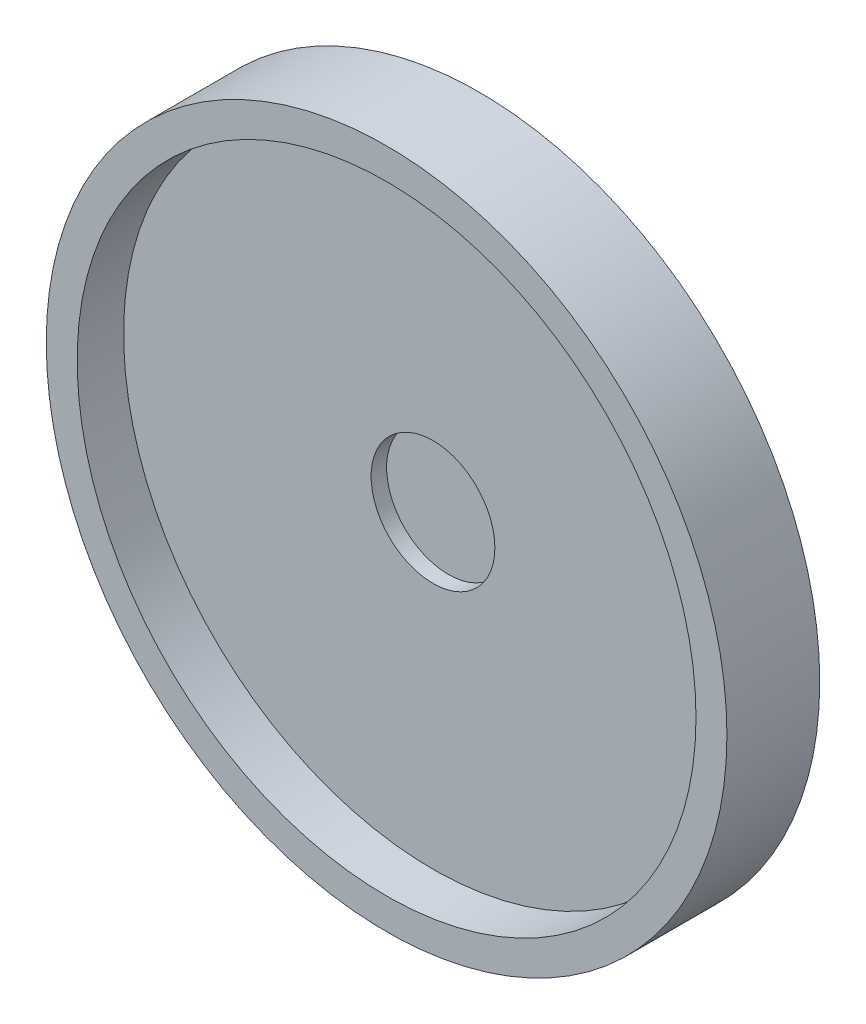
ISO-10303-21;
HEADER;
FILE_DESCRIPTION(('STEP AP214'),'2;1');
FILE_NAME('part.step','',(''),(''),'','','');
FILE_SCHEMA(('AUTOMOTIVE_DESIGN { 1 0 10303 214 1 1 1 1 }'));
ENDSEC;
DATA;
#1=APPLICATION_CONTEXT('core data for automotive mechanical design processes');
#2=APPLICATION_PROTOCOL_DEFINITION('international standard','automotive_design',2000,#1);
#3=PRODUCT_CONTEXT('',#1,'mechanical');
#4=PRODUCT('Part','Part','',(#3));
#5=PRODUCT_RELATED_PRODUCT_CATEGORY('part','',(#4));
#6=PRODUCT_DEFINITION_FORMATION('','',#4);
#7=PRODUCT_DEFINITION_CONTEXT('part definition',#1,'design');
#8=PRODUCT_DEFINITION('design','',#6,#7);
#9=PRODUCT_DEFINITION_SHAPE('','',#8);
#10=(LENGTH_UNIT() NAMED_UNIT(*) SI_UNIT(.MILLI.,.METRE.));
#11=(NAMED_UNIT(*) PLANE_ANGLE_UNIT() SI_UNIT($,.RADIAN.));
#12=(NAMED_UNIT(*) SI_UNIT($,.STERADIAN.) SOLID_ANGLE_UNIT());
#13=UNCERTAINTY_MEASURE_WITH_UNIT(LENGTH_MEASURE(1.E-05),#10,'distance_accuracy_value','');
#14=(GEOMETRIC_REPRESENTATION_CONTEXT(3) GLOBAL_UNCERTAINTY_ASSIGNED_CONTEXT((#13)) GLOBAL_UNIT_ASSIGNED_CONTEXT((#10,
#11,#12)) REPRESENTATION_CONTEXT('',''));
#15=CARTESIAN_POINT('',(0.,0.,0.));
#16=DIRECTION('',(0.,0.,1.));
#17=DIRECTION('',(1.,0.,0.));
#18=AXIS2_PLACEMENT_3D('',#15,#16,#17);
#19=CARTESIAN_POINT('',(0.,0.,3.));
#20=DIRECTION('',(0.,0.,-1.));
#21=DIRECTION('',(-1.,0.,0.));
#22=AXIS2_PLACEMENT_3D('',#19,#20,#21);
#23=CYLINDRICAL_SURFACE('',#22,4.);
#24=CARTESIAN_POINT('',(0.,0.,2.));
#25=DIRECTION('',(0.,0.,1.));
#26=DIRECTION('',(1.,0.,0.));
#27=AXIS2_PLACEMENT_3D('',#24,#25,#26);
#28=CIRCLE('',#27,4.);
#29=CARTESIAN_POINT('',(4.,0.,2.));
#30=VERTEX_POINT('',#29);
#31=EDGE_CURVE('E10',#30,#30,#28,.T.);
#32=ORIENTED_EDGE('',*,*,#31,.F.);
#33=EDGE_LOOP('',(#32));
#34=FACE_BOUND('',#33,.T.);
#35=CARTESIAN_POINT('',(0.,0.,3.));
#36=DIRECTION('',(0.,0.,1.));
#37=DIRECTION('',(1.,0.,0.));
#38=AXIS2_PLACEMENT_3D('',#35,#36,#37);
#39=CIRCLE('',#38,4.);
#40=CARTESIAN_POINT('',(4.,0.,3.));
#41=VERTEX_POINT('',#40);
#42=EDGE_CURVE('E42',#41,#41,#39,.T.);
#43=ORIENTED_EDGE('',*,*,#42,.T.);
#44=EDGE_LOOP('',(#43));
#45=FACE_BOUND('',#44,.T.);
#46=ADVANCED_FACE('F36',(#34,#45),#23,.F.);
#47=CARTESIAN_POINT('',(0.,0.,3.));
#48=DIRECTION('',(0.,0.,1.));
#49=DIRECTION('',(1.,0.,0.));
#50=AXIS2_PLACEMENT_3D('',#47,#48,#49);
#51=PLANE('',#50);
#52=ORIENTED_EDGE('',*,*,#42,.F.);
#53=EDGE_LOOP('',(#52));
#54=FACE_BOUND('',#53,.T.);
#55=CARTESIAN_POINT('',(0.,0.,3.));
#56=DIRECTION('',(0.,0.,1.));
#57=DIRECTION('',(1.,0.,0.));
#58=AXIS2_PLACEMENT_3D('',#55,#56,#57);
#59=CIRCLE('',#58,20.);
#60=CARTESIAN_POINT('',(20.,0.,3.));
#61=VERTEX_POINT('',#60);
#62=EDGE_CURVE('E46',#61,#61,#59,.F.);
#63=ORIENTED_EDGE('',*,*,#62,.F.);
#64=EDGE_LOOP('',(#63));
#65=FACE_BOUND('',#64,.T.);
#66=ADVANCED_FACE('F79',(#54,#65),#51,.T.);
#67=CARTESIAN_POINT('',(0.,0.,0.));
#68=DIRECTION('',(0.,0.,1.));
#69=DIRECTION('',(1.,0.,0.));
#70=AXIS2_PLACEMENT_3D('',#67,#68,#69);
#71=PLANE('',#70);
#72=CARTESIAN_POINT('',(0.,0.,0.));
#73=DIRECTION('',(0.,0.,1.));
#74=DIRECTION('',(1.,0.,0.));
#75=AXIS2_PLACEMENT_3D('',#72,#73,#74);
#76=CIRCLE('',#75,22.);
#77=CARTESIAN_POINT('',(22.,0.,0.));
#78=VERTEX_POINT('',#77);
#79=EDGE_CURVE('E53',#78,#78,#76,.T.);
#80=ORIENTED_EDGE('',*,*,#79,.F.);
#81=EDGE_LOOP('',(#80));
#82=FACE_BOUND('',#81,.T.);
#83=ADVANCED_FACE('F77',(#82),#71,.F.);
#84=CARTESIAN_POINT('',(0.,0.,6.));
#85=DIRECTION('',(0.,0.,-1.));
#86=DIRECTION('',(-1.,0.,0.));
#87=AXIS2_PLACEMENT_3D('',#84,#85,#86);
#88=CYLINDRICAL_SURFACE('',#87,20.);
#89=ORIENTED_EDGE('',*,*,#62,.T.);
#90=EDGE_LOOP('',(#89));
#91=FACE_BOUND('',#90,.T.);
#92=CARTESIAN_POINT('',(0.,0.,6.));
#93=DIRECTION('',(0.,0.,1.));
#94=DIRECTION('',(1.,0.,0.));
#95=AXIS2_PLACEMENT_3D('',#92,#93,#94);
#96=CIRCLE('',#95,20.);
#97=CARTESIAN_POINT('',(20.,0.,6.));
#98=VERTEX_POINT('',#97);
#99=EDGE_CURVE('E56',#98,#98,#96,.T.);
#100=ORIENTED_EDGE('',*,*,#99,.T.);
#101=EDGE_LOOP('',(#100));
#102=FACE_BOUND('',#101,.T.);
#103=ADVANCED_FACE('F62',(#91,#102),#88,.F.);
#104=CARTESIAN_POINT('',(0.,0.,6.));
#105=DIRECTION('',(0.,0.,-1.));
#106=DIRECTION('',(-1.,0.,0.));
#107=AXIS2_PLACEMENT_3D('',#104,#105,#106);
#108=CYLINDRICAL_SURFACE('',#107,22.);
#109=CARTESIAN_POINT('',(0.,0.,6.));
#110=DIRECTION('',(0.,0.,1.));
#111=DIRECTION('',(1.,0.,0.));
#112=AXIS2_PLACEMENT_3D('',#109,#110,#111);
#113=CIRCLE('',#112,22.);
#114=CARTESIAN_POINT('',(22.,0.,6.));
#115=VERTEX_POINT('',#114);
#116=EDGE_CURVE('E50',#115,#115,#113,.T.);
#117=ORIENTED_EDGE('',*,*,#116,.F.);
#118=EDGE_LOOP('',(#117));
#119=FACE_BOUND('',#118,.T.);
#120=ORIENTED_EDGE('',*,*,#79,.T.);
#121=EDGE_LOOP('',(#120));
#122=FACE_BOUND('',#121,.T.);
#123=ADVANCED_FACE('F68',(#119,#122),#108,.T.);
#124=CARTESIAN_POINT('',(0.,0.,6.));
#125=DIRECTION('',(0.,0.,1.));
#126=DIRECTION('',(1.,0.,0.));
#127=AXIS2_PLACEMENT_3D('',#124,#125,#126);
#128=PLANE('',#127);
#129=ORIENTED_EDGE('',*,*,#99,.F.);
#130=EDGE_LOOP('',(#129));
#131=FACE_BOUND('',#130,.T.);
#132=ORIENTED_EDGE('',*,*,#116,.T.);
#133=EDGE_LOOP('',(#132));
#134=FACE_BOUND('',#133,.T.);
#135=ADVANCED_FACE('F64',(#131,#134),#128,.T.);
#136=CARTESIAN_POINT('',(0.,0.,2.));
#137=DIRECTION('',(0.,0.,1.));
#138=DIRECTION('',(1.,0.,0.));
#139=AXIS2_PLACEMENT_3D('',#136,#137,#138);
#140=PLANE('',#139);
#141=ORIENTED_EDGE('',*,*,#31,.T.);
#142=EDGE_LOOP('',(#141));
#143=FACE_BOUND('',#142,.T.);
#144=ADVANCED_FACE('F67',(#143),#140,.T.);
#145=CLOSED_SHELL('',(#46,#66,#83,#103,#123,#135,#144));
#146=MANIFOLD_SOLID_BREP('B2',#145);
#147=ADVANCED_BREP_SHAPE_REPRESENTATION('',(#18,#146),#14);
#148=SHAPE_DEFINITION_REPRESENTATION(#9,#147);
ENDSEC;
END-ISO-10303-21;
